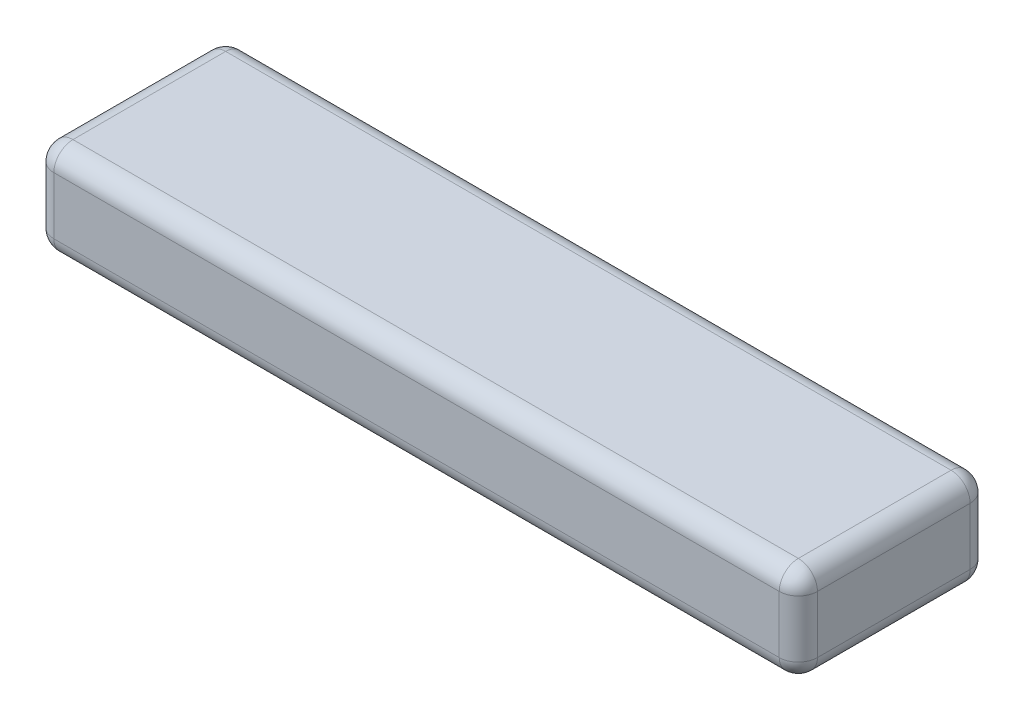
ISO-10303-21;
HEADER;
FILE_DESCRIPTION(('STEP AP214'),'2;1');
FILE_NAME('part.step','',(''),(''),'','','');
FILE_SCHEMA(('AUTOMOTIVE_DESIGN { 1 0 10303 214 1 1 1 1 }'));
ENDSEC;
DATA;
#1=APPLICATION_CONTEXT('core data for automotive mechanical design processes');
#2=APPLICATION_PROTOCOL_DEFINITION('international standard','automotive_design',2000,#1);
#3=PRODUCT_CONTEXT('',#1,'mechanical');
#4=PRODUCT('Part','Part','',(#3));
#5=PRODUCT_RELATED_PRODUCT_CATEGORY('part','',(#4));
#6=PRODUCT_DEFINITION_FORMATION('','',#4);
#7=PRODUCT_DEFINITION_CONTEXT('part definition',#1,'design');
#8=PRODUCT_DEFINITION('design','',#6,#7);
#9=PRODUCT_DEFINITION_SHAPE('','',#8);
#10=(LENGTH_UNIT() NAMED_UNIT(*) SI_UNIT(.MILLI.,.METRE.));
#11=(NAMED_UNIT(*) PLANE_ANGLE_UNIT() SI_UNIT($,.RADIAN.));
#12=(NAMED_UNIT(*) SI_UNIT($,.STERADIAN.) SOLID_ANGLE_UNIT());
#13=UNCERTAINTY_MEASURE_WITH_UNIT(LENGTH_MEASURE(1.E-05),#10,'distance_accuracy_value','');
#14=(GEOMETRIC_REPRESENTATION_CONTEXT(3) GLOBAL_UNCERTAINTY_ASSIGNED_CONTEXT((#13)) GLOBAL_UNIT_ASSIGNED_CONTEXT((#10,
#11,#12)) REPRESENTATION_CONTEXT('',''));
#15=CARTESIAN_POINT('',(0.,0.,0.));
#16=DIRECTION('',(0.,0.,1.));
#17=DIRECTION('',(1.,0.,0.));
#18=AXIS2_PLACEMENT_3D('',#15,#16,#17);
#19=CARTESIAN_POINT('',(20.,5.,-5.));
#20=DIRECTION('',(-1.,0.,0.));
#21=DIRECTION('',(0.,0.,1.));
#22=AXIS2_PLACEMENT_3D('',#19,#20,#21);
#23=PLANE('',#22);
#24=DIRECTION('',(0.,0.,-1.));
#25=VECTOR('',#24,1.);
#26=CARTESIAN_POINT('',(20.,1.,-5.));
#27=LINE('',#26,#25);
#28=CARTESIAN_POINT('',(20.,1.,4.));
#29=VERTEX_POINT('',#28);
#30=CARTESIAN_POINT('',(20.,1.,-4.));
#31=VERTEX_POINT('',#30);
#32=EDGE_CURVE('E218',#29,#31,#27,.T.);
#33=ORIENTED_EDGE('',*,*,#32,.T.);
#34=DIRECTION('',(0.,-1.,0.));
#35=VECTOR('',#34,1.);
#36=CARTESIAN_POINT('',(20.,5.,-4.));
#37=LINE('',#36,#35);
#38=CARTESIAN_POINT('',(20.,4.,-4.));
#39=VERTEX_POINT('',#38);
#40=EDGE_CURVE('E221',#31,#39,#37,.F.);
#41=ORIENTED_EDGE('',*,*,#40,.T.);
#42=DIRECTION('',(0.,0.,-1.));
#43=VECTOR('',#42,1.);
#44=CARTESIAN_POINT('',(20.,4.,5.));
#45=LINE('',#44,#43);
#46=CARTESIAN_POINT('',(20.,4.,4.));
#47=VERTEX_POINT('',#46);
#48=EDGE_CURVE('E212',#39,#47,#45,.F.);
#49=ORIENTED_EDGE('',*,*,#48,.T.);
#50=DIRECTION('',(0.,-1.,0.));
#51=VECTOR('',#50,1.);
#52=CARTESIAN_POINT('',(20.,5.,4.));
#53=LINE('',#52,#51);
#54=EDGE_CURVE('E215',#47,#29,#53,.T.);
#55=ORIENTED_EDGE('',*,*,#54,.T.);
#56=EDGE_LOOP('',(#33,#41,#49,#55));
#57=FACE_BOUND('',#56,.T.);
#58=ADVANCED_FACE('F47',(#57),#23,.F.);
#59=CARTESIAN_POINT('',(-20.,5.,-5.));
#60=DIRECTION('',(0.,0.,1.));
#61=DIRECTION('',(1.,0.,0.));
#62=AXIS2_PLACEMENT_3D('',#59,#60,#61);
#63=PLANE('',#62);
#64=DIRECTION('',(-1.,0.,0.));
#65=VECTOR('',#64,1.);
#66=CARTESIAN_POINT('',(-20.,1.,-5.));
#67=LINE('',#66,#65);
#68=CARTESIAN_POINT('',(19.,1.,-5.));
#69=VERTEX_POINT('',#68);
#70=CARTESIAN_POINT('',(-19.,1.,-5.));
#71=VERTEX_POINT('',#70);
#72=EDGE_CURVE('E192',#69,#71,#67,.T.);
#73=ORIENTED_EDGE('',*,*,#72,.T.);
#74=DIRECTION('',(0.,-1.,0.));
#75=VECTOR('',#74,1.);
#76=CARTESIAN_POINT('',(-19.,5.,-5.));
#77=LINE('',#76,#75);
#78=CARTESIAN_POINT('',(-19.,4.,-5.));
#79=VERTEX_POINT('',#78);
#80=EDGE_CURVE('E195',#71,#79,#77,.F.);
#81=ORIENTED_EDGE('',*,*,#80,.T.);
#82=DIRECTION('',(-1.,0.,0.));
#83=VECTOR('',#82,1.);
#84=CARTESIAN_POINT('',(20.,4.,-5.));
#85=LINE('',#84,#83);
#86=CARTESIAN_POINT('',(19.,4.,-5.));
#87=VERTEX_POINT('',#86);
#88=EDGE_CURVE('E186',#79,#87,#85,.F.);
#89=ORIENTED_EDGE('',*,*,#88,.T.);
#90=DIRECTION('',(0.,-1.,0.));
#91=VECTOR('',#90,1.);
#92=CARTESIAN_POINT('',(19.,5.,-5.));
#93=LINE('',#92,#91);
#94=EDGE_CURVE('E189',#87,#69,#93,.T.);
#95=ORIENTED_EDGE('',*,*,#94,.T.);
#96=EDGE_LOOP('',(#73,#81,#89,#95));
#97=FACE_BOUND('',#96,.T.);
#98=ADVANCED_FACE('F366',(#97),#63,.F.);
#99=CARTESIAN_POINT('',(-20.,5.,-5.));
#100=DIRECTION('',(1.,0.,0.));
#101=DIRECTION('',(0.,0.,-1.));
#102=AXIS2_PLACEMENT_3D('',#99,#100,#101);
#103=PLANE('',#102);
#104=DIRECTION('',(0.,0.,1.));
#105=VECTOR('',#104,1.);
#106=CARTESIAN_POINT('',(-20.,4.,-5.));
#107=LINE('',#106,#105);
#108=CARTESIAN_POINT('',(-20.,4.,4.));
#109=VERTEX_POINT('',#108);
#110=CARTESIAN_POINT('',(-20.,4.,-4.));
#111=VERTEX_POINT('',#110);
#112=EDGE_CURVE('E140',#109,#111,#107,.F.);
#113=ORIENTED_EDGE('',*,*,#112,.T.);
#114=DIRECTION('',(0.,-1.,0.));
#115=VECTOR('',#114,1.);
#116=CARTESIAN_POINT('',(-20.,5.,-4.));
#117=LINE('',#116,#115);
#118=CARTESIAN_POINT('',(-20.,1.,-4.));
#119=VERTEX_POINT('',#118);
#120=EDGE_CURVE('E183',#111,#119,#117,.T.);
#121=ORIENTED_EDGE('',*,*,#120,.T.);
#122=DIRECTION('',(0.,0.,1.));
#123=VECTOR('',#122,1.);
#124=CARTESIAN_POINT('',(-20.,1.,-5.));
#125=LINE('',#124,#123);
#126=CARTESIAN_POINT('',(-20.,1.,4.));
#127=VERTEX_POINT('',#126);
#128=EDGE_CURVE('E143',#119,#127,#125,.T.);
#129=ORIENTED_EDGE('',*,*,#128,.T.);
#130=DIRECTION('',(0.,-1.,0.));
#131=VECTOR('',#130,1.);
#132=CARTESIAN_POINT('',(-20.,5.,4.));
#133=LINE('',#132,#131);
#134=EDGE_CURVE('E135',#127,#109,#133,.F.);
#135=ORIENTED_EDGE('',*,*,#134,.T.);
#136=EDGE_LOOP('',(#113,#121,#129,#135));
#137=FACE_BOUND('',#136,.T.);
#138=ADVANCED_FACE('F137',(#137),#103,.F.);
#139=CARTESIAN_POINT('',(-20.,5.,5.));
#140=DIRECTION('',(0.,0.,-1.));
#141=DIRECTION('',(-1.,0.,0.));
#142=AXIS2_PLACEMENT_3D('',#139,#140,#141);
#143=PLANE('',#142);
#144=DIRECTION('',(0.,-1.,0.));
#145=VECTOR('',#144,1.);
#146=CARTESIAN_POINT('',(-19.,5.,5.));
#147=LINE('',#146,#145);
#148=CARTESIAN_POINT('',(-19.,4.,5.));
#149=VERTEX_POINT('',#148);
#150=CARTESIAN_POINT('',(-19.,1.,5.));
#151=VERTEX_POINT('',#150);
#152=EDGE_CURVE('E155',#149,#151,#147,.T.);
#153=ORIENTED_EDGE('',*,*,#152,.T.);
#154=DIRECTION('',(1.,0.,0.));
#155=VECTOR('',#154,1.);
#156=CARTESIAN_POINT('',(-20.,1.,5.));
#157=LINE('',#156,#155);
#158=CARTESIAN_POINT('',(19.,1.,5.));
#159=VERTEX_POINT('',#158);
#160=EDGE_CURVE('E233',#151,#159,#157,.T.);
#161=ORIENTED_EDGE('',*,*,#160,.T.);
#162=DIRECTION('',(0.,-1.,0.));
#163=VECTOR('',#162,1.);
#164=CARTESIAN_POINT('',(19.,5.,5.));
#165=LINE('',#164,#163);
#166=CARTESIAN_POINT('',(19.,4.,5.));
#167=VERTEX_POINT('',#166);
#168=EDGE_CURVE('E228',#159,#167,#165,.F.);
#169=ORIENTED_EDGE('',*,*,#168,.T.);
#170=DIRECTION('',(1.,0.,0.));
#171=VECTOR('',#170,1.);
#172=CARTESIAN_POINT('',(-20.,4.,5.));
#173=LINE('',#172,#171);
#174=EDGE_CURVE('E225',#167,#149,#173,.F.);
#175=ORIENTED_EDGE('',*,*,#174,.T.);
#176=EDGE_LOOP('',(#153,#161,#169,#175));
#177=FACE_BOUND('',#176,.T.);
#178=ADVANCED_FACE('F357',(#177),#143,.F.);
#179=CARTESIAN_POINT('',(0.,5.,0.));
#180=DIRECTION('',(0.,1.,0.));
#181=DIRECTION('',(0.,0.,1.));
#182=AXIS2_PLACEMENT_3D('',#179,#180,#181);
#183=PLANE('',#182);
#184=DIRECTION('',(0.,0.,1.));
#185=VECTOR('',#184,1.);
#186=CARTESIAN_POINT('',(-19.,5.,5.));
#187=LINE('',#186,#185);
#188=CARTESIAN_POINT('',(-19.,5.,-4.));
#189=VERTEX_POINT('',#188);
#190=CARTESIAN_POINT('',(-19.,5.,4.));
#191=VERTEX_POINT('',#190);
#192=EDGE_CURVE('E57',#189,#191,#187,.T.);
#193=ORIENTED_EDGE('',*,*,#192,.T.);
#194=DIRECTION('',(1.,0.,0.));
#195=VECTOR('',#194,1.);
#196=CARTESIAN_POINT('',(20.,5.,4.));
#197=LINE('',#196,#195);
#198=CARTESIAN_POINT('',(19.,5.,4.));
#199=VERTEX_POINT('',#198);
#200=EDGE_CURVE('E11',#191,#199,#197,.T.);
#201=ORIENTED_EDGE('',*,*,#200,.T.);
#202=DIRECTION('',(0.,0.,-1.));
#203=VECTOR('',#202,1.);
#204=CARTESIAN_POINT('',(19.,5.,-5.));
#205=LINE('',#204,#203);
#206=CARTESIAN_POINT('',(19.,5.,-4.));
#207=VERTEX_POINT('',#206);
#208=EDGE_CURVE('E236',#199,#207,#205,.T.);
#209=ORIENTED_EDGE('',*,*,#208,.T.);
#210=DIRECTION('',(-1.,0.,0.));
#211=VECTOR('',#210,1.);
#212=CARTESIAN_POINT('',(-20.,5.,-4.));
#213=LINE('',#212,#211);
#214=EDGE_CURVE('E68',#207,#189,#213,.T.);
#215=ORIENTED_EDGE('',*,*,#214,.T.);
#216=EDGE_LOOP('',(#193,#201,#209,#215));
#217=FACE_BOUND('',#216,.T.);
#218=ADVANCED_FACE('F359',(#217),#183,.T.);
#219=CARTESIAN_POINT('',(0.,0.,0.));
#220=DIRECTION('',(0.,1.,0.));
#221=DIRECTION('',(0.,0.,1.));
#222=AXIS2_PLACEMENT_3D('',#219,#220,#221);
#223=PLANE('',#222);
#224=DIRECTION('',(0.,0.,1.));
#225=VECTOR('',#224,1.);
#226=CARTESIAN_POINT('',(-19.,0.,0.));
#227=LINE('',#226,#225);
#228=CARTESIAN_POINT('',(-19.,0.,4.));
#229=VERTEX_POINT('',#228);
#230=CARTESIAN_POINT('',(-19.,0.,-4.));
#231=VERTEX_POINT('',#230);
#232=EDGE_CURVE('E205',#229,#231,#227,.F.);
#233=ORIENTED_EDGE('',*,*,#232,.T.);
#234=DIRECTION('',(-1.,0.,0.));
#235=VECTOR('',#234,1.);
#236=CARTESIAN_POINT('',(0.,0.,-4.));
#237=LINE('',#236,#235);
#238=CARTESIAN_POINT('',(19.,0.,-4.));
#239=VERTEX_POINT('',#238);
#240=EDGE_CURVE('E208',#231,#239,#237,.F.);
#241=ORIENTED_EDGE('',*,*,#240,.T.);
#242=DIRECTION('',(0.,0.,-1.));
#243=VECTOR('',#242,1.);
#244=CARTESIAN_POINT('',(19.,0.,0.));
#245=LINE('',#244,#243);
#246=CARTESIAN_POINT('',(19.,0.,4.));
#247=VERTEX_POINT('',#246);
#248=EDGE_CURVE('E202',#239,#247,#245,.F.);
#249=ORIENTED_EDGE('',*,*,#248,.T.);
#250=DIRECTION('',(1.,0.,0.));
#251=VECTOR('',#250,1.);
#252=CARTESIAN_POINT('',(0.,0.,4.));
#253=LINE('',#252,#251);
#254=EDGE_CURVE('E199',#247,#229,#253,.F.);
#255=ORIENTED_EDGE('',*,*,#254,.T.);
#256=EDGE_LOOP('',(#233,#241,#249,#255));
#257=FACE_BOUND('',#256,.T.);
#258=ADVANCED_FACE('F327',(#257),#223,.F.);
#259=CARTESIAN_POINT('',(19.,5.,4.));
#260=DIRECTION('',(0.,-1.,0.));
#261=DIRECTION('',(0.,0.,-1.));
#262=AXIS2_PLACEMENT_3D('',#259,#260,#261);
#263=CYLINDRICAL_SURFACE('',#262,1.);
#264=CARTESIAN_POINT('',(19.,4.,4.));
#265=DIRECTION('',(0.,1.,0.));
#266=DIRECTION('',(0.,0.,1.));
#267=AXIS2_PLACEMENT_3D('',#264,#265,#266);
#268=CIRCLE('',#267,1.);
#269=EDGE_CURVE('E51',#167,#47,#268,.T.);
#270=ORIENTED_EDGE('',*,*,#269,.F.);
#271=ORIENTED_EDGE('',*,*,#168,.F.);
#272=CARTESIAN_POINT('',(19.,1.,4.));
#273=DIRECTION('',(0.,-1.,0.));
#274=DIRECTION('',(0.,0.,-1.));
#275=AXIS2_PLACEMENT_3D('',#272,#273,#274);
#276=CIRCLE('',#275,1.);
#277=EDGE_CURVE('E179',#29,#159,#276,.T.);
#278=ORIENTED_EDGE('',*,*,#277,.F.);
#279=ORIENTED_EDGE('',*,*,#54,.F.);
#280=EDGE_LOOP('',(#270,#271,#278,#279));
#281=FACE_BOUND('',#280,.T.);
#282=ADVANCED_FACE('F49',(#281),#263,.T.);
#283=CARTESIAN_POINT('',(19.,4.,4.));
#284=DIRECTION('',(1.,0.,0.));
#285=DIRECTION('',(0.,0.,-1.));
#286=AXIS2_PLACEMENT_3D('',#283,#284,#285);
#287=SPHERICAL_SURFACE('',#286,1.);
#288=CARTESIAN_POINT('',(19.,4.,4.));
#289=DIRECTION('',(1.,0.,0.));
#290=DIRECTION('',(0.,0.,-1.));
#291=AXIS2_PLACEMENT_3D('',#288,#289,#290);
#292=CIRCLE('',#291,1.);
#293=EDGE_CURVE('E302',#167,#199,#292,.F.);
#294=ORIENTED_EDGE('',*,*,#293,.F.);
#295=ORIENTED_EDGE('',*,*,#269,.T.);
#296=CARTESIAN_POINT('',(19.,4.,4.));
#297=DIRECTION('',(0.,0.,1.));
#298=DIRECTION('',(0.,-1.,0.));
#299=AXIS2_PLACEMENT_3D('',#296,#297,#298);
#300=CIRCLE('',#299,1.);
#301=EDGE_CURVE('E306',#199,#47,#300,.F.);
#302=ORIENTED_EDGE('',*,*,#301,.F.);
#303=EDGE_LOOP('',(#294,#295,#302));
#304=FACE_BOUND('',#303,.T.);
#305=ADVANCED_FACE('F352',(#304),#287,.T.);
#306=CARTESIAN_POINT('',(19.,1.,4.));
#307=DIRECTION('',(0.,0.,1.));
#308=DIRECTION('',(1.,0.,0.));
#309=AXIS2_PLACEMENT_3D('',#306,#307,#308);
#310=SPHERICAL_SURFACE('',#309,1.);
#311=CARTESIAN_POINT('',(19.,1.,4.));
#312=DIRECTION('',(0.,0.,1.));
#313=DIRECTION('',(1.,0.,0.));
#314=AXIS2_PLACEMENT_3D('',#311,#312,#313);
#315=CIRCLE('',#314,1.);
#316=EDGE_CURVE('E294',#29,#247,#315,.F.);
#317=ORIENTED_EDGE('',*,*,#316,.F.);
#318=ORIENTED_EDGE('',*,*,#277,.T.);
#319=CARTESIAN_POINT('',(19.,1.,4.));
#320=DIRECTION('',(1.,0.,0.));
#321=DIRECTION('',(0.,0.,-1.));
#322=AXIS2_PLACEMENT_3D('',#319,#320,#321);
#323=CIRCLE('',#322,1.);
#324=EDGE_CURVE('E298',#247,#159,#323,.F.);
#325=ORIENTED_EDGE('',*,*,#324,.F.);
#326=EDGE_LOOP('',(#317,#318,#325));
#327=FACE_BOUND('',#326,.T.);
#328=ADVANCED_FACE('F315',(#327),#310,.T.);
#329=CARTESIAN_POINT('',(19.,4.,0.));
#330=DIRECTION('',(0.,0.,1.));
#331=DIRECTION('',(1.,0.,0.));
#332=AXIS2_PLACEMENT_3D('',#329,#330,#331);
#333=CYLINDRICAL_SURFACE('',#332,1.);
#334=ORIENTED_EDGE('',*,*,#301,.T.);
#335=ORIENTED_EDGE('',*,*,#48,.F.);
#336=CARTESIAN_POINT('',(19.,4.,-4.));
#337=DIRECTION('',(0.,0.,-1.));
#338=DIRECTION('',(-1.,0.,0.));
#339=AXIS2_PLACEMENT_3D('',#336,#337,#338);
#340=CIRCLE('',#339,1.);
#341=EDGE_CURVE('E287',#207,#39,#340,.T.);
#342=ORIENTED_EDGE('',*,*,#341,.F.);
#343=ORIENTED_EDGE('',*,*,#208,.F.);
#344=EDGE_LOOP('',(#334,#335,#342,#343));
#345=FACE_BOUND('',#344,.T.);
#346=ADVANCED_FACE('F347',(#345),#333,.T.);
#347=CARTESIAN_POINT('',(0.,4.,4.));
#348=DIRECTION('',(-1.,0.,0.));
#349=DIRECTION('',(0.,0.,1.));
#350=AXIS2_PLACEMENT_3D('',#347,#348,#349);
#351=CYLINDRICAL_SURFACE('',#350,1.);
#352=ORIENTED_EDGE('',*,*,#293,.T.);
#353=ORIENTED_EDGE('',*,*,#200,.F.);
#354=CARTESIAN_POINT('',(-19.,4.,4.));
#355=DIRECTION('',(-1.,0.,0.));
#356=DIRECTION('',(0.,0.,1.));
#357=AXIS2_PLACEMENT_3D('',#354,#355,#356);
#358=CIRCLE('',#357,1.);
#359=EDGE_CURVE('E160',#149,#191,#358,.T.);
#360=ORIENTED_EDGE('',*,*,#359,.F.);
#361=ORIENTED_EDGE('',*,*,#174,.F.);
#362=EDGE_LOOP('',(#352,#353,#360,#361));
#363=FACE_BOUND('',#362,.T.);
#364=ADVANCED_FACE('F355',(#363),#351,.T.);
#365=CARTESIAN_POINT('',(-19.,5.,4.));
#366=DIRECTION('',(0.,-1.,0.));
#367=DIRECTION('',(0.,0.,-1.));
#368=AXIS2_PLACEMENT_3D('',#365,#366,#367);
#369=CYLINDRICAL_SURFACE('',#368,1.);
#370=CARTESIAN_POINT('',(-19.,1.,4.));
#371=DIRECTION('',(0.,-1.,0.));
#372=DIRECTION('',(0.,0.,-1.));
#373=AXIS2_PLACEMENT_3D('',#370,#371,#372);
#374=CIRCLE('',#373,1.);
#375=EDGE_CURVE('E161',#151,#127,#374,.T.);
#376=ORIENTED_EDGE('',*,*,#375,.F.);
#377=ORIENTED_EDGE('',*,*,#152,.F.);
#378=CARTESIAN_POINT('',(-19.,4.,4.));
#379=DIRECTION('',(0.,1.,0.));
#380=DIRECTION('',(0.,0.,1.));
#381=AXIS2_PLACEMENT_3D('',#378,#379,#380);
#382=CIRCLE('',#381,1.);
#383=EDGE_CURVE('E151',#109,#149,#382,.T.);
#384=ORIENTED_EDGE('',*,*,#383,.F.);
#385=ORIENTED_EDGE('',*,*,#134,.F.);
#386=EDGE_LOOP('',(#376,#377,#384,#385));
#387=FACE_BOUND('',#386,.T.);
#388=ADVANCED_FACE('F153',(#387),#369,.T.);
#389=CARTESIAN_POINT('',(-20.,1.,4.));
#390=DIRECTION('',(1.,0.,0.));
#391=DIRECTION('',(0.,0.,-1.));
#392=AXIS2_PLACEMENT_3D('',#389,#390,#391);
#393=CYLINDRICAL_SURFACE('',#392,1.);
#394=ORIENTED_EDGE('',*,*,#324,.T.);
#395=ORIENTED_EDGE('',*,*,#160,.F.);
#396=CARTESIAN_POINT('',(-19.,1.,4.));
#397=DIRECTION('',(-1.,0.,0.));
#398=DIRECTION('',(0.,0.,1.));
#399=AXIS2_PLACEMENT_3D('',#396,#397,#398);
#400=CIRCLE('',#399,1.);
#401=EDGE_CURVE('E280',#229,#151,#400,.T.);
#402=ORIENTED_EDGE('',*,*,#401,.F.);
#403=ORIENTED_EDGE('',*,*,#254,.F.);
#404=EDGE_LOOP('',(#394,#395,#402,#403));
#405=FACE_BOUND('',#404,.T.);
#406=ADVANCED_FACE('F323',(#405),#393,.T.);
#407=CARTESIAN_POINT('',(19.,1.,-5.));
#408=DIRECTION('',(0.,0.,-1.));
#409=DIRECTION('',(-1.,0.,0.));
#410=AXIS2_PLACEMENT_3D('',#407,#408,#409);
#411=CYLINDRICAL_SURFACE('',#410,1.);
#412=ORIENTED_EDGE('',*,*,#316,.T.);
#413=ORIENTED_EDGE('',*,*,#248,.F.);
#414=CARTESIAN_POINT('',(19.,1.,-4.));
#415=DIRECTION('',(0.,0.,-1.));
#416=DIRECTION('',(-1.,0.,0.));
#417=AXIS2_PLACEMENT_3D('',#414,#415,#416);
#418=CIRCLE('',#417,1.);
#419=EDGE_CURVE('E276',#31,#239,#418,.T.);
#420=ORIENTED_EDGE('',*,*,#419,.F.);
#421=ORIENTED_EDGE('',*,*,#32,.F.);
#422=EDGE_LOOP('',(#412,#413,#420,#421));
#423=FACE_BOUND('',#422,.T.);
#424=ADVANCED_FACE('F333',(#423),#411,.T.);
#425=CARTESIAN_POINT('',(19.,5.,-4.));
#426=DIRECTION('',(0.,-1.,0.));
#427=DIRECTION('',(0.,0.,-1.));
#428=AXIS2_PLACEMENT_3D('',#425,#426,#427);
#429=CYLINDRICAL_SURFACE('',#428,1.);
#430=CARTESIAN_POINT('',(19.,4.,-4.));
#431=DIRECTION('',(0.,1.,0.));
#432=DIRECTION('',(0.,0.,1.));
#433=AXIS2_PLACEMENT_3D('',#430,#431,#432);
#434=CIRCLE('',#433,1.);
#435=EDGE_CURVE('E290',#39,#87,#434,.T.);
#436=ORIENTED_EDGE('',*,*,#435,.F.);
#437=ORIENTED_EDGE('',*,*,#40,.F.);
#438=CARTESIAN_POINT('',(19.,1.,-4.));
#439=DIRECTION('',(0.,-1.,0.));
#440=DIRECTION('',(0.,0.,-1.));
#441=AXIS2_PLACEMENT_3D('',#438,#439,#440);
#442=CIRCLE('',#441,1.);
#443=EDGE_CURVE('E272',#69,#31,#442,.T.);
#444=ORIENTED_EDGE('',*,*,#443,.F.);
#445=ORIENTED_EDGE('',*,*,#94,.F.);
#446=EDGE_LOOP('',(#436,#437,#444,#445));
#447=FACE_BOUND('',#446,.T.);
#448=ADVANCED_FACE('F339',(#447),#429,.T.);
#449=CARTESIAN_POINT('',(19.,4.,-4.));
#450=DIRECTION('',(1.,0.,0.));
#451=DIRECTION('',(0.,0.,-1.));
#452=AXIS2_PLACEMENT_3D('',#449,#450,#451);
#453=SPHERICAL_SURFACE('',#452,1.);
#454=ORIENTED_EDGE('',*,*,#341,.T.);
#455=ORIENTED_EDGE('',*,*,#435,.T.);
#456=CARTESIAN_POINT('',(19.,4.,-4.));
#457=DIRECTION('',(1.,0.,0.));
#458=DIRECTION('',(0.,0.,-1.));
#459=AXIS2_PLACEMENT_3D('',#456,#457,#458);
#460=CIRCLE('',#459,1.);
#461=EDGE_CURVE('E168',#207,#87,#460,.F.);
#462=ORIENTED_EDGE('',*,*,#461,.F.);
#463=EDGE_LOOP('',(#454,#455,#462));
#464=FACE_BOUND('',#463,.T.);
#465=ADVANCED_FACE('F413',(#464),#453,.T.);
#466=CARTESIAN_POINT('',(-19.,4.,4.));
#467=DIRECTION('',(0.,0.,1.));
#468=DIRECTION('',(1.,0.,0.));
#469=AXIS2_PLACEMENT_3D('',#466,#467,#468);
#470=SPHERICAL_SURFACE('',#469,1.);
#471=ORIENTED_EDGE('',*,*,#383,.T.);
#472=ORIENTED_EDGE('',*,*,#359,.T.);
#473=CARTESIAN_POINT('',(-19.,4.,4.));
#474=DIRECTION('',(0.,0.,1.));
#475=DIRECTION('',(1.,0.,0.));
#476=AXIS2_PLACEMENT_3D('',#473,#474,#475);
#477=CIRCLE('',#476,1.);
#478=EDGE_CURVE('E164',#109,#191,#477,.F.);
#479=ORIENTED_EDGE('',*,*,#478,.F.);
#480=EDGE_LOOP('',(#471,#472,#479));
#481=FACE_BOUND('',#480,.T.);
#482=ADVANCED_FACE('F165',(#481),#470,.T.);
#483=CARTESIAN_POINT('',(-19.,1.,4.));
#484=DIRECTION('',(0.,0.,1.));
#485=DIRECTION('',(1.,0.,0.));
#486=AXIS2_PLACEMENT_3D('',#483,#484,#485);
#487=SPHERICAL_SURFACE('',#486,1.);
#488=ORIENTED_EDGE('',*,*,#401,.T.);
#489=ORIENTED_EDGE('',*,*,#375,.T.);
#490=CARTESIAN_POINT('',(-19.,1.,4.));
#491=DIRECTION('',(0.,0.,1.));
#492=DIRECTION('',(1.,0.,0.));
#493=AXIS2_PLACEMENT_3D('',#490,#491,#492);
#494=CIRCLE('',#493,1.);
#495=EDGE_CURVE('E169',#229,#127,#494,.F.);
#496=ORIENTED_EDGE('',*,*,#495,.F.);
#497=EDGE_LOOP('',(#488,#489,#496));
#498=FACE_BOUND('',#497,.T.);
#499=ADVANCED_FACE('F406',(#498),#487,.T.);
#500=CARTESIAN_POINT('',(19.,1.,-4.));
#501=DIRECTION('',(1.,0.,0.));
#502=DIRECTION('',(0.,0.,-1.));
#503=AXIS2_PLACEMENT_3D('',#500,#501,#502);
#504=SPHERICAL_SURFACE('',#503,1.);
#505=ORIENTED_EDGE('',*,*,#443,.T.);
#506=ORIENTED_EDGE('',*,*,#419,.T.);
#507=CARTESIAN_POINT('',(19.,1.,-4.));
#508=DIRECTION('',(1.,0.,0.));
#509=DIRECTION('',(0.,0.,-1.));
#510=AXIS2_PLACEMENT_3D('',#507,#508,#509);
#511=CIRCLE('',#510,1.);
#512=EDGE_CURVE('E263',#69,#239,#511,.F.);
#513=ORIENTED_EDGE('',*,*,#512,.F.);
#514=EDGE_LOOP('',(#505,#506,#513));
#515=FACE_BOUND('',#514,.T.);
#516=ADVANCED_FACE('F402',(#515),#504,.T.);
#517=CARTESIAN_POINT('',(0.,4.,-4.));
#518=DIRECTION('',(1.,0.,0.));
#519=DIRECTION('',(0.,0.,-1.));
#520=AXIS2_PLACEMENT_3D('',#517,#518,#519);
#521=CYLINDRICAL_SURFACE('',#520,1.);
#522=ORIENTED_EDGE('',*,*,#461,.T.);
#523=ORIENTED_EDGE('',*,*,#88,.F.);
#524=CARTESIAN_POINT('',(-19.,4.,-4.));
#525=DIRECTION('',(-1.,0.,0.));
#526=DIRECTION('',(0.,0.,1.));
#527=AXIS2_PLACEMENT_3D('',#524,#525,#526);
#528=CIRCLE('',#527,1.);
#529=EDGE_CURVE('E259',#189,#79,#528,.T.);
#530=ORIENTED_EDGE('',*,*,#529,.F.);
#531=ORIENTED_EDGE('',*,*,#214,.F.);
#532=EDGE_LOOP('',(#522,#523,#530,#531));
#533=FACE_BOUND('',#532,.T.);
#534=ADVANCED_FACE('F399',(#533),#521,.T.);
#535=CARTESIAN_POINT('',(-19.,4.,0.));
#536=DIRECTION('',(0.,0.,-1.));
#537=DIRECTION('',(-1.,0.,0.));
#538=AXIS2_PLACEMENT_3D('',#535,#536,#537);
#539=CYLINDRICAL_SURFACE('',#538,1.);
#540=ORIENTED_EDGE('',*,*,#478,.T.);
#541=ORIENTED_EDGE('',*,*,#192,.F.);
#542=CARTESIAN_POINT('',(-19.,4.,-4.));
#543=DIRECTION('',(0.,0.,-1.));
#544=DIRECTION('',(-1.,0.,0.));
#545=AXIS2_PLACEMENT_3D('',#542,#543,#544);
#546=CIRCLE('',#545,1.);
#547=EDGE_CURVE('E173',#111,#189,#546,.T.);
#548=ORIENTED_EDGE('',*,*,#547,.F.);
#549=ORIENTED_EDGE('',*,*,#112,.F.);
#550=EDGE_LOOP('',(#540,#541,#548,#549));
#551=FACE_BOUND('',#550,.T.);
#552=ADVANCED_FACE('F171',(#551),#539,.T.);
#553=CARTESIAN_POINT('',(-19.,1.,-5.));
#554=DIRECTION('',(0.,0.,1.));
#555=DIRECTION('',(1.,0.,0.));
#556=AXIS2_PLACEMENT_3D('',#553,#554,#555);
#557=CYLINDRICAL_SURFACE('',#556,1.);
#558=ORIENTED_EDGE('',*,*,#495,.T.);
#559=ORIENTED_EDGE('',*,*,#128,.F.);
#560=CARTESIAN_POINT('',(-19.,1.,-4.));
#561=DIRECTION('',(0.,0.,-1.));
#562=DIRECTION('',(-1.,0.,0.));
#563=AXIS2_PLACEMENT_3D('',#560,#561,#562);
#564=CIRCLE('',#563,1.);
#565=EDGE_CURVE('E253',#231,#119,#564,.T.);
#566=ORIENTED_EDGE('',*,*,#565,.F.);
#567=ORIENTED_EDGE('',*,*,#232,.F.);
#568=EDGE_LOOP('',(#558,#559,#566,#567));
#569=FACE_BOUND('',#568,.T.);
#570=ADVANCED_FACE('F392',(#569),#557,.T.);
#571=CARTESIAN_POINT('',(-20.,1.,-4.));
#572=DIRECTION('',(-1.,0.,0.));
#573=DIRECTION('',(0.,0.,1.));
#574=AXIS2_PLACEMENT_3D('',#571,#572,#573);
#575=CYLINDRICAL_SURFACE('',#574,1.);
#576=ORIENTED_EDGE('',*,*,#512,.T.);
#577=ORIENTED_EDGE('',*,*,#240,.F.);
#578=CARTESIAN_POINT('',(-19.,1.,-4.));
#579=DIRECTION('',(-1.,0.,0.));
#580=DIRECTION('',(0.,0.,1.));
#581=AXIS2_PLACEMENT_3D('',#578,#579,#580);
#582=CIRCLE('',#581,1.);
#583=EDGE_CURVE('E249',#71,#231,#582,.T.);
#584=ORIENTED_EDGE('',*,*,#583,.F.);
#585=ORIENTED_EDGE('',*,*,#72,.F.);
#586=EDGE_LOOP('',(#576,#577,#584,#585));
#587=FACE_BOUND('',#586,.T.);
#588=ADVANCED_FACE('F388',(#587),#575,.T.);
#589=CARTESIAN_POINT('',(-19.,4.,-4.));
#590=DIRECTION('',(0.,1.,0.));
#591=DIRECTION('',(0.,0.,1.));
#592=AXIS2_PLACEMENT_3D('',#589,#590,#591);
#593=SPHERICAL_SURFACE('',#592,1.);
#594=ORIENTED_EDGE('',*,*,#547,.T.);
#595=ORIENTED_EDGE('',*,*,#529,.T.);
#596=CARTESIAN_POINT('',(-19.,4.,-4.));
#597=DIRECTION('',(0.,1.,0.));
#598=DIRECTION('',(0.,0.,1.));
#599=AXIS2_PLACEMENT_3D('',#596,#597,#598);
#600=CIRCLE('',#599,1.);
#601=EDGE_CURVE('E246',#111,#79,#600,.F.);
#602=ORIENTED_EDGE('',*,*,#601,.F.);
#603=EDGE_LOOP('',(#594,#595,#602));
#604=FACE_BOUND('',#603,.T.);
#605=ADVANCED_FACE('F384',(#604),#593,.T.);
#606=CARTESIAN_POINT('',(-19.,1.,-4.));
#607=DIRECTION('',(0.,-1.,0.));
#608=DIRECTION('',(0.,0.,-1.));
#609=AXIS2_PLACEMENT_3D('',#606,#607,#608);
#610=SPHERICAL_SURFACE('',#609,1.);
#611=ORIENTED_EDGE('',*,*,#583,.T.);
#612=ORIENTED_EDGE('',*,*,#565,.T.);
#613=CARTESIAN_POINT('',(-19.,1.,-4.));
#614=DIRECTION('',(0.,-1.,0.));
#615=DIRECTION('',(0.,0.,-1.));
#616=AXIS2_PLACEMENT_3D('',#613,#614,#615);
#617=CIRCLE('',#616,1.);
#618=EDGE_CURVE('E243',#71,#119,#617,.F.);
#619=ORIENTED_EDGE('',*,*,#618,.F.);
#620=EDGE_LOOP('',(#611,#612,#619));
#621=FACE_BOUND('',#620,.T.);
#622=ADVANCED_FACE('F380',(#621),#610,.T.);
#623=CARTESIAN_POINT('',(-19.,5.,-4.));
#624=DIRECTION('',(0.,-1.,0.));
#625=DIRECTION('',(0.,0.,-1.));
#626=AXIS2_PLACEMENT_3D('',#623,#624,#625);
#627=CYLINDRICAL_SURFACE('',#626,1.);
#628=ORIENTED_EDGE('',*,*,#601,.T.);
#629=ORIENTED_EDGE('',*,*,#80,.F.);
#630=ORIENTED_EDGE('',*,*,#618,.T.);
#631=ORIENTED_EDGE('',*,*,#120,.F.);
#632=EDGE_LOOP('',(#628,#629,#630,#631));
#633=FACE_BOUND('',#632,.T.);
#634=ADVANCED_FACE('F377',(#633),#627,.T.);
#635=CLOSED_SHELL('',(#58,#98,#138,#178,#218,#258,#282,#305,#328,#346,#364,#388,#406,#424,#448,
#465,#482,#499,#516,#534,#552,#570,#588,#605,#622,#634));
#636=MANIFOLD_SOLID_BREP('B2',#635);
#637=ADVANCED_BREP_SHAPE_REPRESENTATION('',(#18,#636),#14);
#638=SHAPE_DEFINITION_REPRESENTATION(#9,#637);
ENDSEC;
END-ISO-10303-21;
